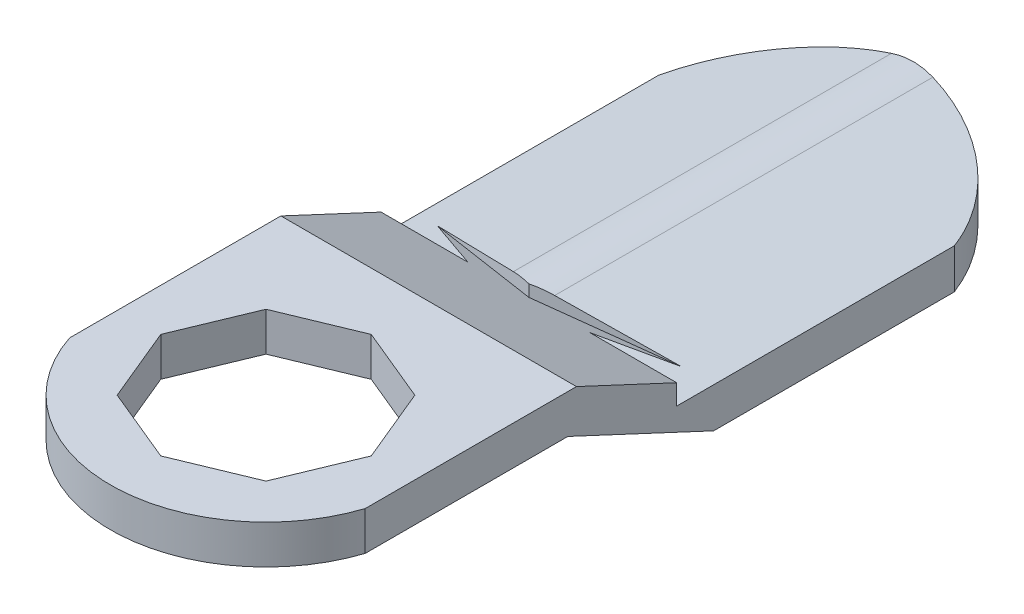
ISO-10303-21;
HEADER;
FILE_DESCRIPTION(('STEP AP214'),'2;1');
FILE_NAME('part.step','',(''),(''),'','','');
FILE_SCHEMA(('AUTOMOTIVE_DESIGN { 1 0 10303 214 1 1 1 1 }'));
ENDSEC;
DATA;
#1=APPLICATION_CONTEXT('core data for automotive mechanical design processes');
#2=APPLICATION_PROTOCOL_DEFINITION('international standard','automotive_design',2000,#1);
#3=PRODUCT_CONTEXT('',#1,'mechanical');
#4=PRODUCT('Part','Part','',(#3));
#5=PRODUCT_RELATED_PRODUCT_CATEGORY('part','',(#4));
#6=PRODUCT_DEFINITION_FORMATION('','',#4);
#7=PRODUCT_DEFINITION_CONTEXT('part definition',#1,'design');
#8=PRODUCT_DEFINITION('design','',#6,#7);
#9=PRODUCT_DEFINITION_SHAPE('','',#8);
#10=(LENGTH_UNIT() NAMED_UNIT(*) SI_UNIT(.MILLI.,.METRE.));
#11=(NAMED_UNIT(*) PLANE_ANGLE_UNIT() SI_UNIT($,.RADIAN.));
#12=(NAMED_UNIT(*) SI_UNIT($,.STERADIAN.) SOLID_ANGLE_UNIT());
#13=UNCERTAINTY_MEASURE_WITH_UNIT(LENGTH_MEASURE(1.E-05),#10,'distance_accuracy_value','');
#14=(GEOMETRIC_REPRESENTATION_CONTEXT(3) GLOBAL_UNCERTAINTY_ASSIGNED_CONTEXT((#13)) GLOBAL_UNIT_ASSIGNED_CONTEXT((#10,
#11,#12)) REPRESENTATION_CONTEXT('',''));
#15=CARTESIAN_POINT('',(0.,0.,0.));
#16=DIRECTION('',(0.,0.,1.));
#17=DIRECTION('',(1.,0.,0.));
#18=AXIS2_PLACEMENT_3D('',#15,#16,#17);
#19=CARTESIAN_POINT('',(0.,2.,0.));
#20=DIRECTION('',(0.,-1.,0.));
#21=DIRECTION('',(0.,0.,-1.));
#22=AXIS2_PLACEMENT_3D('',#19,#20,#21);
#23=PLANE('',#22);
#24=DIRECTION('',(-0.923879532511282,0.,-0.382683432365101));
#25=VECTOR('',#24,1.);
#26=CARTESIAN_POINT('',(3.82683432365094,2.,-3.82683432365085));
#27=LINE('',#26,#25);
#28=CARTESIAN_POINT('',(3.82683432365094,2.,-3.82683432365085));
#29=VERTEX_POINT('',#28);
#30=CARTESIAN_POINT('',(0.,2.,-5.41196100146197));
#31=VERTEX_POINT('',#30);
#32=EDGE_CURVE('E328',#29,#31,#27,.T.);
#33=ORIENTED_EDGE('',*,*,#32,.F.);
#34=DIRECTION('',(-0.382683432365084,0.,-0.923879532511289));
#35=VECTOR('',#34,1.);
#36=CARTESIAN_POINT('',(5.41196100146197,2.,0.));
#37=LINE('',#36,#35);
#38=CARTESIAN_POINT('',(5.41196100146197,2.,0.));
#39=VERTEX_POINT('',#38);
#40=EDGE_CURVE('E343',#39,#29,#37,.T.);
#41=ORIENTED_EDGE('',*,*,#40,.F.);
#42=DIRECTION('',(0.382683432365096,0.,-0.923879532511284));
#43=VECTOR('',#42,1.);
#44=CARTESIAN_POINT('',(3.82683432365085,2.,3.82683432365095));
#45=LINE('',#44,#43);
#46=CARTESIAN_POINT('',(3.82683432365085,2.,3.82683432365095));
#47=VERTEX_POINT('',#46);
#48=EDGE_CURVE('E341',#47,#39,#45,.T.);
#49=ORIENTED_EDGE('',*,*,#48,.F.);
#50=DIRECTION('',(0.923879532511291,0.,-0.382683432365079));
#51=VECTOR('',#50,1.);
#52=CARTESIAN_POINT('',(0.,2.,5.41196100146197));
#53=LINE('',#52,#51);
#54=CARTESIAN_POINT('',(0.,2.,5.41196100146197));
#55=VERTEX_POINT('',#54);
#56=EDGE_CURVE('E339',#55,#47,#53,.T.);
#57=ORIENTED_EDGE('',*,*,#56,.F.);
#58=DIRECTION('',(0.923879532511282,0.,0.382683432365102));
#59=VECTOR('',#58,1.);
#60=CARTESIAN_POINT('',(-3.82683432365095,2.,3.82683432365085));
#61=LINE('',#60,#59);
#62=CARTESIAN_POINT('',(-3.82683432365095,2.,3.82683432365085));
#63=VERTEX_POINT('',#62);
#64=EDGE_CURVE('E337',#63,#55,#61,.T.);
#65=ORIENTED_EDGE('',*,*,#64,.F.);
#66=DIRECTION('',(0.382683432365078,0.,0.923879532511292));
#67=VECTOR('',#66,1.);
#68=CARTESIAN_POINT('',(-5.41196100146197,2.,0.));
#69=LINE('',#68,#67);
#70=CARTESIAN_POINT('',(-5.41196100146197,2.,0.));
#71=VERTEX_POINT('',#70);
#72=EDGE_CURVE('E335',#71,#63,#69,.T.);
#73=ORIENTED_EDGE('',*,*,#72,.F.);
#74=DIRECTION('',(-0.382683432365101,0.,0.923879532511282));
#75=VECTOR('',#74,1.);
#76=CARTESIAN_POINT('',(-3.82683432365085,2.,-3.82683432365095));
#77=LINE('',#76,#75);
#78=CARTESIAN_POINT('',(-3.82683432365085,2.,-3.82683432365095));
#79=VERTEX_POINT('',#78);
#80=EDGE_CURVE('E333',#79,#71,#77,.T.);
#81=ORIENTED_EDGE('',*,*,#80,.F.);
#82=DIRECTION('',(-0.923879532511292,0.,0.382683432365078));
#83=VECTOR('',#82,1.);
#84=CARTESIAN_POINT('',(0.,2.,-5.41196100146197));
#85=LINE('',#84,#83);
#86=EDGE_CURVE('E330',#31,#79,#85,.T.);
#87=ORIENTED_EDGE('',*,*,#86,.F.);
#88=EDGE_LOOP('',(#33,#41,#49,#57,#65,#73,#81,#87));
#89=FACE_BOUND('',#88,.T.);
#90=DIRECTION('',(-1.,0.,0.));
#91=VECTOR('',#90,1.);
#92=CARTESIAN_POINT('',(43.9052680421348,2.,-8.36433897369595));
#93=LINE('',#92,#91);
#94=CARTESIAN_POINT('',(7.6,2.,-8.36433897369594));
#95=VERTEX_POINT('',#94);
#96=CARTESIAN_POINT('',(-7.6,2.,-8.36433897369593));
#97=VERTEX_POINT('',#96);
#98=EDGE_CURVE('E450',#95,#97,#93,.T.);
#99=ORIENTED_EDGE('',*,*,#98,.T.);
#100=DIRECTION('',(0.,0.,1.));
#101=VECTOR('',#100,1.);
#102=CARTESIAN_POINT('',(-7.6,2.,2.49799919935938));
#103=LINE('',#102,#101);
#104=CARTESIAN_POINT('',(-7.6,2.,2.49799919935938));
#105=VERTEX_POINT('',#104);
#106=EDGE_CURVE('E315',#97,#105,#103,.T.);
#107=ORIENTED_EDGE('',*,*,#106,.T.);
#108=CARTESIAN_POINT('',(0.,2.,0.));
#109=DIRECTION('',(0.,1.,0.));
#110=DIRECTION('',(0.,0.,-1.));
#111=AXIS2_PLACEMENT_3D('',#108,#109,#110);
#112=CIRCLE('',#111,8.);
#113=CARTESIAN_POINT('',(7.6,2.,2.49799919935937));
#114=VERTEX_POINT('',#113);
#115=EDGE_CURVE('E385',#105,#114,#112,.T.);
#116=ORIENTED_EDGE('',*,*,#115,.T.);
#117=DIRECTION('',(0.,0.,-1.));
#118=VECTOR('',#117,1.);
#119=CARTESIAN_POINT('',(7.6,2.,2.49799919935937));
#120=LINE('',#119,#118);
#121=EDGE_CURVE('E388',#114,#95,#120,.T.);
#122=ORIENTED_EDGE('',*,*,#121,.T.);
#123=EDGE_LOOP('',(#99,#107,#116,#122));
#124=FACE_BOUND('',#123,.T.);
#125=ADVANCED_FACE('F35',(#89,#124),#23,.F.);
#126=CARTESIAN_POINT('',(7.6,2.,2.49799919935937));
#127=DIRECTION('',(-1.,0.,0.));
#128=DIRECTION('',(0.,0.,1.));
#129=AXIS2_PLACEMENT_3D('',#126,#127,#128);
#130=PLANE('',#129);
#131=DIRECTION('',(0.,0.,-1.));
#132=VECTOR('',#131,1.);
#133=CARTESIAN_POINT('',(7.6,0.,2.49799919935937));
#134=LINE('',#133,#132);
#135=CARTESIAN_POINT('',(7.6,0.,2.49799919935937));
#136=VERTEX_POINT('',#135);
#137=CARTESIAN_POINT('',(7.59999999999999,0.,-7.92064030019684));
#138=VERTEX_POINT('',#137);
#139=EDGE_CURVE('E396',#136,#138,#134,.T.);
#140=ORIENTED_EDGE('',*,*,#139,.T.);
#141=DIRECTION('',(0.,0.422885465331124,0.906183139995265));
#142=VECTOR('',#141,1.);
#143=CARTESIAN_POINT('',(7.6,4.35020856734818,1.40123520126355));
#144=LINE('',#143,#142);
#145=CARTESIAN_POINT('',(7.59999999999997,-3.5,-15.4206403001968));
#146=VERTEX_POINT('',#145);
#147=EDGE_CURVE('E454',#146,#138,#144,.T.);
#148=ORIENTED_EDGE('',*,*,#147,.F.);
#149=DIRECTION('',(0.,0.,-1.));
#150=VECTOR('',#149,1.);
#151=CARTESIAN_POINT('',(7.6,-3.5,-15.4206403001968));
#152=LINE('',#151,#150);
#153=CARTESIAN_POINT('',(7.59999999999997,-3.5,-27.7979991993594));
#154=VERTEX_POINT('',#153);
#155=EDGE_CURVE('E441',#146,#154,#152,.T.);
#156=ORIENTED_EDGE('',*,*,#155,.T.);
#157=DIRECTION('',(0.,1.,0.));
#158=VECTOR('',#157,1.);
#159=CARTESIAN_POINT('',(7.59999999999997,-3.5,-27.7979991993594));
#160=LINE('',#159,#158);
#161=CARTESIAN_POINT('',(7.59999999999997,-1.44636409465411,-27.7979991993594));
#162=VERTEX_POINT('',#161);
#163=EDGE_CURVE('E227',#154,#162,#160,.T.);
#164=ORIENTED_EDGE('',*,*,#163,.T.);
#165=DIRECTION('',(0.,0.,-1.));
#166=VECTOR('',#165,1.);
#167=CARTESIAN_POINT('',(7.59999999999997,-1.44636409465411,-13.5177767182546));
#168=LINE('',#167,#166);
#169=CARTESIAN_POINT('',(7.59999999999997,-1.44636409465411,-13.5177767182546));
#170=VERTEX_POINT('',#169);
#171=EDGE_CURVE('E216',#170,#162,#168,.T.);
#172=ORIENTED_EDGE('',*,*,#171,.F.);
#173=DIRECTION('',(0.,1.,0.));
#174=VECTOR('',#173,1.);
#175=CARTESIAN_POINT('',(7.6,2.,-13.5177767182546));
#176=LINE('',#175,#174);
#177=CARTESIAN_POINT('',(7.6,-0.404937614127393,-13.5177767182546));
#178=VERTEX_POINT('',#177);
#179=EDGE_CURVE('E202',#170,#178,#176,.T.);
#180=ORIENTED_EDGE('',*,*,#179,.T.);
#181=DIRECTION('',(0.,-0.422885465331124,-0.906183139995265));
#182=VECTOR('',#181,1.);
#183=CARTESIAN_POINT('',(7.6,6.16257484733871,0.555464270601307));
#184=LINE('',#183,#182);
#185=EDGE_CURVE('E319',#95,#178,#184,.T.);
#186=ORIENTED_EDGE('',*,*,#185,.F.);
#187=ORIENTED_EDGE('',*,*,#121,.F.);
#188=DIRECTION('',(0.,-1.,0.));
#189=VECTOR('',#188,1.);
#190=CARTESIAN_POINT('',(7.6,2.,2.49799919935937));
#191=LINE('',#190,#189);
#192=EDGE_CURVE('E404',#114,#136,#191,.T.);
#193=ORIENTED_EDGE('',*,*,#192,.T.);
#194=EDGE_LOOP('',(#140,#148,#156,#164,#172,#180,#186,#187,#193));
#195=FACE_BOUND('',#194,.T.);
#196=ADVANCED_FACE('F224',(#195),#130,.F.);
#197=CARTESIAN_POINT('',(-7.6,2.,2.49799919935938));
#198=DIRECTION('',(1.,0.,0.));
#199=DIRECTION('',(0.,0.,-1.));
#200=AXIS2_PLACEMENT_3D('',#197,#198,#199);
#201=PLANE('',#200);
#202=DIRECTION('',(0.,0.422885465331124,0.906183139995265));
#203=VECTOR('',#202,1.);
#204=CARTESIAN_POINT('',(-7.6,6.16257484733871,0.555464270601309));
#205=LINE('',#204,#203);
#206=CARTESIAN_POINT('',(-7.6,-0.404937614127395,-13.5177767182546));
#207=VERTEX_POINT('',#206);
#208=EDGE_CURVE('E312',#207,#97,#205,.T.);
#209=ORIENTED_EDGE('',*,*,#208,.F.);
#210=DIRECTION('',(0.,-1.,0.));
#211=VECTOR('',#210,1.);
#212=CARTESIAN_POINT('',(-7.6,2.,-13.5177767182546));
#213=LINE('',#212,#211);
#214=CARTESIAN_POINT('',(-7.59999999999997,-1.44636409465411,-13.5177767182546));
#215=VERTEX_POINT('',#214);
#216=EDGE_CURVE('E238',#207,#215,#213,.T.);
#217=ORIENTED_EDGE('',*,*,#216,.T.);
#218=DIRECTION('',(0.,0.,-1.));
#219=VECTOR('',#218,1.);
#220=CARTESIAN_POINT('',(-7.59999999999997,-1.44636409465411,-13.5177767182546));
#221=LINE('',#220,#219);
#222=CARTESIAN_POINT('',(-7.59999999999997,-1.44636409465411,-27.7979991993594));
#223=VERTEX_POINT('',#222);
#224=EDGE_CURVE('E485',#215,#223,#221,.T.);
#225=ORIENTED_EDGE('',*,*,#224,.T.);
#226=DIRECTION('',(0.,1.,0.));
#227=VECTOR('',#226,1.);
#228=CARTESIAN_POINT('',(-7.59999999999997,-3.5,-27.7979991993594));
#229=LINE('',#228,#227);
#230=CARTESIAN_POINT('',(-7.59999999999997,-3.5,-27.7979991993594));
#231=VERTEX_POINT('',#230);
#232=EDGE_CURVE('E439',#231,#223,#229,.T.);
#233=ORIENTED_EDGE('',*,*,#232,.F.);
#234=DIRECTION('',(0.,0.,1.));
#235=VECTOR('',#234,1.);
#236=CARTESIAN_POINT('',(-7.59999999999997,-3.5,-15.4206403001968));
#237=LINE('',#236,#235);
#238=CARTESIAN_POINT('',(-7.59999999999997,-3.5,-15.4206403001968));
#239=VERTEX_POINT('',#238);
#240=EDGE_CURVE('E429',#231,#239,#237,.T.);
#241=ORIENTED_EDGE('',*,*,#240,.T.);
#242=DIRECTION('',(0.,-0.422885465331124,-0.906183139995265));
#243=VECTOR('',#242,1.);
#244=CARTESIAN_POINT('',(-7.6,4.35020856734818,1.40123520126356));
#245=LINE('',#244,#243);
#246=CARTESIAN_POINT('',(-7.6,0.,-7.92064030019684));
#247=VERTEX_POINT('',#246);
#248=EDGE_CURVE('E437',#247,#239,#245,.T.);
#249=ORIENTED_EDGE('',*,*,#248,.F.);
#250=DIRECTION('',(0.,0.,1.));
#251=VECTOR('',#250,1.);
#252=CARTESIAN_POINT('',(-7.6,0.,2.49799919935938));
#253=LINE('',#252,#251);
#254=CARTESIAN_POINT('',(-7.6,0.,2.49799919935938));
#255=VERTEX_POINT('',#254);
#256=EDGE_CURVE('E389',#247,#255,#253,.T.);
#257=ORIENTED_EDGE('',*,*,#256,.T.);
#258=DIRECTION('',(0.,-1.,0.));
#259=VECTOR('',#258,1.);
#260=CARTESIAN_POINT('',(-7.6,2.,2.49799919935938));
#261=LINE('',#260,#259);
#262=EDGE_CURVE('E393',#105,#255,#261,.T.);
#263=ORIENTED_EDGE('',*,*,#262,.F.);
#264=ORIENTED_EDGE('',*,*,#106,.F.);
#265=EDGE_LOOP('',(#209,#217,#225,#233,#241,#249,#257,#263,#264));
#266=FACE_BOUND('',#265,.T.);
#267=ADVANCED_FACE('F291',(#266),#201,.F.);
#268=CARTESIAN_POINT('',(0.,-6.,9.57557128020675));
#269=DIRECTION('',(0.,1.,0.));
#270=DIRECTION('',(0.,0.,1.));
#271=AXIS2_PLACEMENT_3D('',#268,#269,#270);
#272=CYLINDRICAL_SURFACE('',#271,19.0755712802068);
#273=CARTESIAN_POINT('',(0.,0.,9.57557128020675));
#274=DIRECTION('',(0.,1.,0.));
#275=DIRECTION('',(0.,0.,1.));
#276=AXIS2_PLACEMENT_3D('',#273,#274,#275);
#277=CIRCLE('',#276,19.0755712802068);
#278=EDGE_CURVE('E398',#138,#247,#277,.T.);
#279=ORIENTED_EDGE('',*,*,#278,.T.);
#280=CARTESIAN_POINT('',(0.,8.16489873752167,9.57557128020675));
#281=DIRECTION('',(0.,-0.906183139995265,0.422885465331124));
#282=DIRECTION('',(0.,0.422885465331124,0.906183139995265));
#283=AXIS2_PLACEMENT_3D('',#280,#281,#282);
#284=ELLIPSE('',#283,21.0504592706353,19.0755712802068);
#285=EDGE_CURVE('E324',#247,#138,#284,.T.);
#286=ORIENTED_EDGE('',*,*,#285,.T.);
#287=EDGE_LOOP('',(#279,#286));
#288=FACE_BOUND('',#287,.T.);
#289=ADVANCED_FACE('F301',(#288),#272,.F.);
#290=CARTESIAN_POINT('',(0.,0.,0.));
#291=DIRECTION('',(0.,-1.,0.));
#292=DIRECTION('',(0.,0.,-1.));
#293=AXIS2_PLACEMENT_3D('',#290,#291,#292);
#294=PLANE('',#293);
#295=ORIENTED_EDGE('',*,*,#256,.F.);
#296=ORIENTED_EDGE('',*,*,#278,.F.);
#297=ORIENTED_EDGE('',*,*,#139,.F.);
#298=CARTESIAN_POINT('',(0.,0.,0.));
#299=DIRECTION('',(0.,1.,0.));
#300=DIRECTION('',(0.,0.,-1.));
#301=AXIS2_PLACEMENT_3D('',#298,#299,#300);
#302=CIRCLE('',#301,8.);
#303=EDGE_CURVE('E384',#255,#136,#302,.T.);
#304=ORIENTED_EDGE('',*,*,#303,.F.);
#305=EDGE_LOOP('',(#295,#296,#297,#304));
#306=FACE_BOUND('',#305,.T.);
#307=DIRECTION('',(-0.382683432365084,0.,-0.923879532511289));
#308=VECTOR('',#307,1.);
#309=CARTESIAN_POINT('',(5.41196100146197,0.,0.));
#310=LINE('',#309,#308);
#311=CARTESIAN_POINT('',(5.41196100146197,0.,0.));
#312=VERTEX_POINT('',#311);
#313=CARTESIAN_POINT('',(3.82683432365094,0.,-3.82683432365085));
#314=VERTEX_POINT('',#313);
#315=EDGE_CURVE('E331',#312,#314,#310,.T.);
#316=ORIENTED_EDGE('',*,*,#315,.T.);
#317=DIRECTION('',(-0.923879532511282,0.,-0.382683432365101));
#318=VECTOR('',#317,1.);
#319=CARTESIAN_POINT('',(3.82683432365094,0.,-3.82683432365085));
#320=LINE('',#319,#318);
#321=CARTESIAN_POINT('',(0.,0.,-5.41196100146197));
#322=VERTEX_POINT('',#321);
#323=EDGE_CURVE('E322',#314,#322,#320,.T.);
#324=ORIENTED_EDGE('',*,*,#323,.T.);
#325=DIRECTION('',(-0.923879532511292,0.,0.382683432365078));
#326=VECTOR('',#325,1.);
#327=CARTESIAN_POINT('',(0.,0.,-5.41196100146197));
#328=LINE('',#327,#326);
#329=CARTESIAN_POINT('',(-3.82683432365085,0.,-3.82683432365095));
#330=VERTEX_POINT('',#329);
#331=EDGE_CURVE('E348',#322,#330,#328,.T.);
#332=ORIENTED_EDGE('',*,*,#331,.T.);
#333=DIRECTION('',(-0.382683432365101,0.,0.923879532511282));
#334=VECTOR('',#333,1.);
#335=CARTESIAN_POINT('',(-3.82683432365085,0.,-3.82683432365095));
#336=LINE('',#335,#334);
#337=CARTESIAN_POINT('',(-5.41196100146197,0.,0.));
#338=VERTEX_POINT('',#337);
#339=EDGE_CURVE('E351',#330,#338,#336,.T.);
#340=ORIENTED_EDGE('',*,*,#339,.T.);
#341=DIRECTION('',(0.382683432365078,0.,0.923879532511292));
#342=VECTOR('',#341,1.);
#343=CARTESIAN_POINT('',(-5.41196100146197,0.,0.));
#344=LINE('',#343,#342);
#345=CARTESIAN_POINT('',(-3.82683432365095,0.,3.82683432365085));
#346=VERTEX_POINT('',#345);
#347=EDGE_CURVE('E354',#338,#346,#344,.T.);
#348=ORIENTED_EDGE('',*,*,#347,.T.);
#349=DIRECTION('',(0.923879532511282,0.,0.382683432365102));
#350=VECTOR('',#349,1.);
#351=CARTESIAN_POINT('',(-3.82683432365095,0.,3.82683432365085));
#352=LINE('',#351,#350);
#353=CARTESIAN_POINT('',(0.,0.,5.41196100146197));
#354=VERTEX_POINT('',#353);
#355=EDGE_CURVE('E357',#346,#354,#352,.T.);
#356=ORIENTED_EDGE('',*,*,#355,.T.);
#357=DIRECTION('',(0.923879532511291,0.,-0.382683432365079));
#358=VECTOR('',#357,1.);
#359=CARTESIAN_POINT('',(0.,0.,5.41196100146197));
#360=LINE('',#359,#358);
#361=CARTESIAN_POINT('',(3.82683432365085,0.,3.82683432365095));
#362=VERTEX_POINT('',#361);
#363=EDGE_CURVE('E360',#354,#362,#360,.T.);
#364=ORIENTED_EDGE('',*,*,#363,.T.);
#365=DIRECTION('',(0.382683432365096,0.,-0.923879532511284));
#366=VECTOR('',#365,1.);
#367=CARTESIAN_POINT('',(3.82683432365085,0.,3.82683432365095));
#368=LINE('',#367,#366);
#369=EDGE_CURVE('E363',#362,#312,#368,.T.);
#370=ORIENTED_EDGE('',*,*,#369,.T.);
#371=EDGE_LOOP('',(#316,#324,#332,#340,#348,#356,#364,#370));
#372=FACE_BOUND('',#371,.T.);
#373=ADVANCED_FACE('F298',(#306,#372),#294,.T.);
#374=CARTESIAN_POINT('',(0.,2.,0.));
#375=DIRECTION('',(0.,-1.,0.));
#376=DIRECTION('',(0.,0.,-1.));
#377=AXIS2_PLACEMENT_3D('',#374,#375,#376);
#378=CYLINDRICAL_SURFACE('',#377,8.);
#379=ORIENTED_EDGE('',*,*,#303,.T.);
#380=ORIENTED_EDGE('',*,*,#192,.F.);
#381=ORIENTED_EDGE('',*,*,#115,.F.);
#382=ORIENTED_EDGE('',*,*,#262,.T.);
#383=EDGE_LOOP('',(#379,#380,#381,#382));
#384=FACE_BOUND('',#383,.T.);
#385=ADVANCED_FACE('F37',(#384),#378,.T.);
#386=CARTESIAN_POINT('',(3.82683432365094,2.,-3.82683432365085));
#387=DIRECTION('',(-0.382683432365101,0.,0.923879532511282));
#388=DIRECTION('',(0.923879532511282,0.,0.382683432365101));
#389=AXIS2_PLACEMENT_3D('',#386,#387,#388);
#390=PLANE('',#389);
#391=ORIENTED_EDGE('',*,*,#323,.F.);
#392=DIRECTION('',(0.,-1.,0.));
#393=VECTOR('',#392,1.);
#394=CARTESIAN_POINT('',(3.82683432365094,2.,-3.82683432365085));
#395=LINE('',#394,#393);
#396=EDGE_CURVE('E345',#29,#314,#395,.T.);
#397=ORIENTED_EDGE('',*,*,#396,.F.);
#398=ORIENTED_EDGE('',*,*,#32,.T.);
#399=DIRECTION('',(0.,-1.,0.));
#400=VECTOR('',#399,1.);
#401=CARTESIAN_POINT('',(0.,2.,-5.41196100146197));
#402=LINE('',#401,#400);
#403=EDGE_CURVE('E381',#31,#322,#402,.T.);
#404=ORIENTED_EDGE('',*,*,#403,.T.);
#405=EDGE_LOOP('',(#391,#397,#398,#404));
#406=FACE_BOUND('',#405,.T.);
#407=ADVANCED_FACE('F296',(#406),#390,.T.);
#408=CARTESIAN_POINT('',(0.,2.,-5.41196100146197));
#409=DIRECTION('',(0.382683432365078,0.,0.923879532511292));
#410=DIRECTION('',(0.923879532511292,0.,-0.382683432365078));
#411=AXIS2_PLACEMENT_3D('',#408,#409,#410);
#412=PLANE('',#411);
#413=ORIENTED_EDGE('',*,*,#331,.F.);
#414=ORIENTED_EDGE('',*,*,#403,.F.);
#415=ORIENTED_EDGE('',*,*,#86,.T.);
#416=DIRECTION('',(0.,-1.,0.));
#417=VECTOR('',#416,1.);
#418=CARTESIAN_POINT('',(-3.82683432365085,2.,-3.82683432365095));
#419=LINE('',#418,#417);
#420=EDGE_CURVE('E379',#79,#330,#419,.T.);
#421=ORIENTED_EDGE('',*,*,#420,.T.);
#422=EDGE_LOOP('',(#413,#414,#415,#421));
#423=FACE_BOUND('',#422,.T.);
#424=ADVANCED_FACE('F536',(#423),#412,.T.);
#425=CARTESIAN_POINT('',(-3.82683432365085,2.,-3.82683432365095));
#426=DIRECTION('',(0.923879532511282,0.,0.382683432365101));
#427=DIRECTION('',(0.382683432365101,0.,-0.923879532511282));
#428=AXIS2_PLACEMENT_3D('',#425,#426,#427);
#429=PLANE('',#428);
#430=ORIENTED_EDGE('',*,*,#339,.F.);
#431=ORIENTED_EDGE('',*,*,#420,.F.);
#432=ORIENTED_EDGE('',*,*,#80,.T.);
#433=DIRECTION('',(0.,-1.,0.));
#434=VECTOR('',#433,1.);
#435=CARTESIAN_POINT('',(-5.41196100146197,2.,0.));
#436=LINE('',#435,#434);
#437=EDGE_CURVE('E377',#71,#338,#436,.T.);
#438=ORIENTED_EDGE('',*,*,#437,.T.);
#439=EDGE_LOOP('',(#430,#431,#432,#438));
#440=FACE_BOUND('',#439,.T.);
#441=ADVANCED_FACE('F533',(#440),#429,.T.);
#442=CARTESIAN_POINT('',(-5.41196100146197,2.,0.));
#443=DIRECTION('',(0.923879532511292,0.,-0.382683432365078));
#444=DIRECTION('',(-0.382683432365078,0.,-0.923879532511292));
#445=AXIS2_PLACEMENT_3D('',#442,#443,#444);
#446=PLANE('',#445);
#447=ORIENTED_EDGE('',*,*,#347,.F.);
#448=ORIENTED_EDGE('',*,*,#437,.F.);
#449=ORIENTED_EDGE('',*,*,#72,.T.);
#450=DIRECTION('',(0.,-1.,0.));
#451=VECTOR('',#450,1.);
#452=CARTESIAN_POINT('',(-3.82683432365095,2.,3.82683432365085));
#453=LINE('',#452,#451);
#454=EDGE_CURVE('E375',#63,#346,#453,.T.);
#455=ORIENTED_EDGE('',*,*,#454,.T.);
#456=EDGE_LOOP('',(#447,#448,#449,#455));
#457=FACE_BOUND('',#456,.T.);
#458=ADVANCED_FACE('F529',(#457),#446,.T.);
#459=CARTESIAN_POINT('',(-3.82683432365095,2.,3.82683432365085));
#460=DIRECTION('',(0.382683432365102,0.,-0.923879532511282));
#461=DIRECTION('',(-0.923879532511282,0.,-0.382683432365102));
#462=AXIS2_PLACEMENT_3D('',#459,#460,#461);
#463=PLANE('',#462);
#464=ORIENTED_EDGE('',*,*,#355,.F.);
#465=ORIENTED_EDGE('',*,*,#454,.F.);
#466=ORIENTED_EDGE('',*,*,#64,.T.);
#467=DIRECTION('',(0.,-1.,0.));
#468=VECTOR('',#467,1.);
#469=CARTESIAN_POINT('',(0.,2.,5.41196100146197));
#470=LINE('',#469,#468);
#471=EDGE_CURVE('E373',#55,#354,#470,.T.);
#472=ORIENTED_EDGE('',*,*,#471,.T.);
#473=EDGE_LOOP('',(#464,#465,#466,#472));
#474=FACE_BOUND('',#473,.T.);
#475=ADVANCED_FACE('F525',(#474),#463,.T.);
#476=CARTESIAN_POINT('',(0.,2.,5.41196100146197));
#477=DIRECTION('',(-0.382683432365079,0.,-0.923879532511291));
#478=DIRECTION('',(-0.923879532511291,0.,0.382683432365079));
#479=AXIS2_PLACEMENT_3D('',#476,#477,#478);
#480=PLANE('',#479);
#481=ORIENTED_EDGE('',*,*,#363,.F.);
#482=ORIENTED_EDGE('',*,*,#471,.F.);
#483=ORIENTED_EDGE('',*,*,#56,.T.);
#484=DIRECTION('',(0.,-1.,0.));
#485=VECTOR('',#484,1.);
#486=CARTESIAN_POINT('',(3.82683432365085,2.,3.82683432365095));
#487=LINE('',#486,#485);
#488=EDGE_CURVE('E371',#47,#362,#487,.T.);
#489=ORIENTED_EDGE('',*,*,#488,.T.);
#490=EDGE_LOOP('',(#481,#482,#483,#489));
#491=FACE_BOUND('',#490,.T.);
#492=ADVANCED_FACE('F521',(#491),#480,.T.);
#493=CARTESIAN_POINT('',(3.82683432365085,2.,3.82683432365095));
#494=DIRECTION('',(-0.923879532511284,0.,-0.382683432365096));
#495=DIRECTION('',(-0.382683432365096,0.,0.923879532511285));
#496=AXIS2_PLACEMENT_3D('',#493,#494,#495);
#497=PLANE('',#496);
#498=ORIENTED_EDGE('',*,*,#369,.F.);
#499=ORIENTED_EDGE('',*,*,#488,.F.);
#500=ORIENTED_EDGE('',*,*,#48,.T.);
#501=DIRECTION('',(0.,-1.,0.));
#502=VECTOR('',#501,1.);
#503=CARTESIAN_POINT('',(5.41196100146197,2.,0.));
#504=LINE('',#503,#502);
#505=EDGE_CURVE('E58',#39,#312,#504,.T.);
#506=ORIENTED_EDGE('',*,*,#505,.T.);
#507=EDGE_LOOP('',(#498,#499,#500,#506));
#508=FACE_BOUND('',#507,.T.);
#509=ADVANCED_FACE('F515',(#508),#497,.T.);
#510=CARTESIAN_POINT('',(5.41196100146197,2.,0.));
#511=DIRECTION('',(-0.923879532511289,0.,0.382683432365084));
#512=DIRECTION('',(0.382683432365084,0.,0.923879532511289));
#513=AXIS2_PLACEMENT_3D('',#510,#511,#512);
#514=PLANE('',#513);
#515=ORIENTED_EDGE('',*,*,#315,.F.);
#516=ORIENTED_EDGE('',*,*,#505,.F.);
#517=ORIENTED_EDGE('',*,*,#40,.T.);
#518=ORIENTED_EDGE('',*,*,#396,.T.);
#519=EDGE_LOOP('',(#515,#516,#517,#518));
#520=FACE_BOUND('',#519,.T.);
#521=ADVANCED_FACE('F508',(#520),#514,.T.);
#522=CARTESIAN_POINT('',(43.9052680421348,-3.5,-15.4206403001969));
#523=DIRECTION('',(0.,-0.906183139995265,0.422885465331124));
#524=DIRECTION('',(0.,-0.422885465331124,-0.906183139995265));
#525=AXIS2_PLACEMENT_3D('',#522,#523,#524);
#526=PLANE('',#525);
#527=DIRECTION('',(-0.875730310753049,-0.204169357911961,-0.437505766954202));
#528=VECTOR('',#527,1.);
#529=CARTESIAN_POINT('',(31.899574304697,5.70900261708532,4.31293673641456));
#530=LINE('',#529,#528);
#531=CARTESIAN_POINT('',(-3.79114662753835,-2.61199699509363,-13.5177767182546));
#532=VERTEX_POINT('',#531);
#533=EDGE_CURVE('E247',#532,#239,#530,.T.);
#534=ORIENTED_EDGE('',*,*,#533,.F.);
#535=DIRECTION('',(-1.,0.,0.));
#536=VECTOR('',#535,1.);
#537=CARTESIAN_POINT('',(43.9052680421348,-2.61199699509363,-13.5177767182546));
#538=LINE('',#537,#536);
#539=CARTESIAN_POINT('',(3.79114662753841,-2.61199699509364,-13.5177767182546));
#540=VERTEX_POINT('',#539);
#541=EDGE_CURVE('E236',#540,#532,#538,.T.);
#542=ORIENTED_EDGE('',*,*,#541,.F.);
#543=DIRECTION('',(-0.875730310753049,0.204169357911961,0.437505766954203));
#544=VECTOR('',#543,1.);
#545=CARTESIAN_POINT('',(35.4426399316882,-9.99128372927785,-29.3305340057922));
#546=LINE('',#545,#544);
#547=EDGE_CURVE('E243',#146,#540,#546,.T.);
#548=ORIENTED_EDGE('',*,*,#547,.F.);
#549=ORIENTED_EDGE('',*,*,#147,.T.);
#550=ORIENTED_EDGE('',*,*,#285,.F.);
#551=ORIENTED_EDGE('',*,*,#248,.T.);
#552=EDGE_LOOP('',(#534,#542,#548,#549,#550,#551));
#553=FACE_BOUND('',#552,.T.);
#554=ADVANCED_FACE('F506',(#553),#526,.T.);
#555=CARTESIAN_POINT('',(43.9052680421348,2.,-8.36433897369595));
#556=DIRECTION('',(0.,0.906183139995265,-0.422885465331124));
#557=DIRECTION('',(0.,0.422885465331124,0.906183139995265));
#558=AXIS2_PLACEMENT_3D('',#555,#556,#557);
#559=PLANE('',#558);
#560=DIRECTION('',(1.,0.,0.));
#561=VECTOR('',#560,1.);
#562=CARTESIAN_POINT('',(43.9052680421348,-0.404937614127387,-13.5177767182546));
#563=LINE('',#562,#561);
#564=CARTESIAN_POINT('',(3.13307731999928,-0.404937614127394,-13.5177767182546));
#565=VERTEX_POINT('',#564);
#566=EDGE_CURVE('E207',#565,#178,#563,.T.);
#567=ORIENTED_EDGE('',*,*,#566,.F.);
#568=DIRECTION('',(-0.87573031075305,0.204169357911961,0.437505766954202));
#569=VECTOR('',#568,1.);
#570=CARTESIAN_POINT('',(31.9969469004865,-7.13431268170396,-27.9378661487759));
#571=LINE('',#570,#569);
#572=CARTESIAN_POINT('',(6.28078783844212,-1.13880057119527,-15.0903401976858));
#573=VERTEX_POINT('',#572);
#574=EDGE_CURVE('E219',#573,#565,#571,.T.);
#575=ORIENTED_EDGE('',*,*,#574,.F.);
#576=DIRECTION('',(0.963884768567449,-0.112622706693601,-0.241334371486288));
#577=VECTOR('',#576,1.);
#578=CARTESIAN_POINT('',(8.1109762977113,-1.35264436742896,-15.5485769039009));
#579=LINE('',#578,#577);
#580=CARTESIAN_POINT('',(0.,-0.404937614127395,-13.5177767182546));
#581=VERTEX_POINT('',#580);
#582=EDGE_CURVE('E407',#581,#573,#579,.T.);
#583=ORIENTED_EDGE('',*,*,#582,.F.);
#584=DIRECTION('',(0.963884768567449,0.112622706693601,0.241334371486288));
#585=VECTOR('',#584,1.);
#586=CARTESIAN_POINT('',(-8.1109762977113,-1.35264436742896,-15.5485769039009));
#587=LINE('',#586,#585);
#588=CARTESIAN_POINT('',(-6.28078783844224,-1.1388005711953,-15.0903401976859));
#589=VERTEX_POINT('',#588);
#590=EDGE_CURVE('E320',#589,#581,#587,.T.);
#591=ORIENTED_EDGE('',*,*,#590,.F.);
#592=DIRECTION('',(-0.87573031075305,-0.204169357911961,-0.437505766954202));
#593=VECTOR('',#592,1.);
#594=CARTESIAN_POINT('',(35.3452673358987,8.5659736646592,5.70560459343091));
#595=LINE('',#594,#593);
#596=CARTESIAN_POINT('',(-3.13307731999929,-0.404937614127397,-13.5177767182546));
#597=VERTEX_POINT('',#596);
#598=EDGE_CURVE('E445',#597,#589,#595,.T.);
#599=ORIENTED_EDGE('',*,*,#598,.F.);
#600=EDGE_CURVE('E212',#207,#597,#563,.T.);
#601=ORIENTED_EDGE('',*,*,#600,.F.);
#602=ORIENTED_EDGE('',*,*,#208,.T.);
#603=ORIENTED_EDGE('',*,*,#98,.F.);
#604=ORIENTED_EDGE('',*,*,#185,.T.);
#605=EDGE_LOOP('',(#567,#575,#583,#591,#599,#601,#602,#603,#604));
#606=FACE_BOUND('',#605,.T.);
#607=ADVANCED_FACE('F464',(#606),#559,.T.);
#608=CARTESIAN_POINT('',(-7.59999999999997,-3.5,-15.4206403001968));
#609=DIRECTION('',(-0.242879614259142,0.,0.970056438037154));
#610=DIRECTION('',(0.970056438037154,0.,0.242879614259142));
#611=AXIS2_PLACEMENT_3D('',#608,#609,#610);
#612=PLANE('',#611);
#613=CARTESIAN_POINT('',(0.,-4.48021306335651,-13.5177767182546));
#614=DIRECTION('',(-0.242879614259142,0.,0.970056438037154));
#615=DIRECTION('',(-0.970056438037154,0.,-0.242879614259142));
#616=AXIS2_PLACEMENT_3D('',#613,#614,#615);
#617=ELLIPSE('',#616,4.82468120393759,4.68021306335651);
#618=CARTESIAN_POINT('',(-1.06265515295333,0.0777643767274864,-13.7838409012439));
#619=VERTEX_POINT('',#618);
#620=CARTESIAN_POINT('',(0.,0.2,-13.5177767182546));
#621=VERTEX_POINT('',#620);
#622=EDGE_CURVE('E50',#619,#621,#617,.F.);
#623=ORIENTED_EDGE('',*,*,#622,.F.);
#624=DIRECTION('',(0.946160752544067,0.220589639248988,0.236896689299887));
#625=VECTOR('',#624,1.);
#626=CARTESIAN_POINT('',(-8.02862104275866,-1.54629358437606,-15.5279570597652));
#627=LINE('',#626,#625);
#628=EDGE_CURVE('E474',#589,#619,#627,.T.);
#629=ORIENTED_EDGE('',*,*,#628,.F.);
#630=ORIENTED_EDGE('',*,*,#590,.T.);
#631=DIRECTION('',(0.,1.,0.));
#632=VECTOR('',#631,1.);
#633=CARTESIAN_POINT('',(0.,-3.5,-13.5177767182546));
#634=LINE('',#633,#632);
#635=EDGE_CURVE('E440',#581,#621,#634,.T.);
#636=ORIENTED_EDGE('',*,*,#635,.T.);
#637=EDGE_LOOP('',(#623,#629,#630,#636));
#638=FACE_BOUND('',#637,.T.);
#639=ADVANCED_FACE('F472',(#638),#612,.T.);
#640=CARTESIAN_POINT('',(0.,-3.5,-25.3));
#641=DIRECTION('',(0.,1.,0.));
#642=DIRECTION('',(0.,0.,1.));
#643=AXIS2_PLACEMENT_3D('',#640,#641,#642);
#644=CYLINDRICAL_SURFACE('',#643,8.);
#645=CARTESIAN_POINT('',(0.,0.325513732432385,-25.3));
#646=DIRECTION('',(-0.227052729986448,-0.973882466114726,0.));
#647=DIRECTION('',(-0.973882466114726,0.227052729986448,0.));
#648=AXIS2_PLACEMENT_3D('',#645,#646,#647);
#649=ELLIPSE('',#648,8.21454362138355,8.);
#650=CARTESIAN_POINT('',(1.06265515295333,0.0777643767274862,-33.2291086526735));
#651=VERTEX_POINT('',#650);
#652=EDGE_CURVE('E468',#162,#651,#649,.F.);
#653=ORIENTED_EDGE('',*,*,#652,.F.);
#654=ORIENTED_EDGE('',*,*,#163,.F.);
#655=CARTESIAN_POINT('',(0.,-1.7281221729135,-25.3));
#656=DIRECTION('',(0.227052729986449,0.973882466114726,0.));
#657=DIRECTION('',(-0.973882466114726,0.227052729986449,0.));
#658=AXIS2_PLACEMENT_3D('',#655,#656,#657);
#659=ELLIPSE('',#658,8.21454362138355,8.);
#660=CARTESIAN_POINT('',(0.608549692980437,-1.87000055550196,-33.276820624232));
#661=VERTEX_POINT('',#660);
#662=EDGE_CURVE('E237',#661,#154,#659,.F.);
#663=ORIENTED_EDGE('',*,*,#662,.F.);
#664=CARTESIAN_POINT('',(-0.608549692980438,-1.87000055550196,-33.276820624232));
#665=CARTESIAN_POINT('',(-0.538122667983464,-1.85357096992136,-33.2822026947048));
#666=CARTESIAN_POINT('',(-0.466958116183813,-1.83999468565227,-33.2866848481073));
#667=CARTESIAN_POINT('',(-0.323642988324801,-1.81862814948393,-33.2937703976557));
#668=CARTESIAN_POINT('',(-0.251492010847257,-1.81084032912057,-33.2963730042551));
#669=CARTESIAN_POINT('',(-0.108192009137945,-1.80124048421106,-33.2995836430644));
#670=CARTESIAN_POINT('',(-0.0370515872854555,-1.79931272017633,-33.3002303050087));
#671=CARTESIAN_POINT('',(0.105114534384593,-1.80111940488305,-33.2996249268033));
#672=CARTESIAN_POINT('',(0.176140274813095,-1.8048508829142,-33.2983738828177));
#673=CARTESIAN_POINT('',(0.307525084576295,-1.81700440269085,-33.2943172661232));
#674=CARTESIAN_POINT('',(0.367962025461209,-1.82468234932973,-33.2917585903527));
#675=CARTESIAN_POINT('',(0.488628064232673,-1.84420127475758,-33.2852953933198));
#676=CARTESIAN_POINT('',(0.548850791394042,-1.85607785243271,-33.2813793692532));
#677=CARTESIAN_POINT('',(0.608549692980438,-1.87000055550195,-33.276820624232));
#678=B_SPLINE_CURVE_WITH_KNOTS('',3,(#664,#665,#666,#667,#668,#669,#670,#671,#672,#673,#674,
#675,#676,#677),.UNSPECIFIED.,.F.,.F.,(4,2,2,2,2,2,4),(0.,0.217494674404498,0.435080659336113,
0.648340323448343,0.861488079740926,1.04426533864752,1.22863102017331),.UNSPECIFIED.);
#679=CARTESIAN_POINT('',(-0.608549692980438,-1.87000055550196,-33.276820624232));
#680=VERTEX_POINT('',#679);
#681=EDGE_CURVE('E43',#680,#661,#678,.T.);
#682=ORIENTED_EDGE('',*,*,#681,.F.);
#683=CARTESIAN_POINT('',(0.,-1.7281221729135,-25.3));
#684=DIRECTION('',(-0.227052729986449,0.973882466114726,0.));
#685=DIRECTION('',(0.973882466114726,0.227052729986449,0.));
#686=AXIS2_PLACEMENT_3D('',#683,#684,#685);
#687=ELLIPSE('',#686,8.21454362138355,8.);
#688=EDGE_CURVE('E245',#231,#680,#687,.F.);
#689=ORIENTED_EDGE('',*,*,#688,.F.);
#690=ORIENTED_EDGE('',*,*,#232,.T.);
#691=CARTESIAN_POINT('',(0.,0.325513732432385,-25.3));
#692=DIRECTION('',(0.227052729986448,-0.973882466114726,0.));
#693=DIRECTION('',(0.973882466114726,0.227052729986448,0.));
#694=AXIS2_PLACEMENT_3D('',#691,#692,#693);
#695=ELLIPSE('',#694,8.21454362138355,8.);
#696=CARTESIAN_POINT('',(-1.06265515295333,0.0777643767274862,-33.2291086526735));
#697=VERTEX_POINT('',#696);
#698=EDGE_CURVE('E12',#697,#223,#695,.F.);
#699=ORIENTED_EDGE('',*,*,#698,.F.);
#700=CARTESIAN_POINT('',(1.06265515295333,0.0777643767274862,-33.2291086526735));
#701=CARTESIAN_POINT('',(0.950373095649501,0.103961097950877,-33.2441769390883));
#702=CARTESIAN_POINT('',(0.836810030736546,0.126044046027304,-33.2569490436655));
#703=CARTESIAN_POINT('',(0.607890591984908,0.161795467443306,-33.2776937213362));
#704=CARTESIAN_POINT('',(0.492533537218431,0.175460661663189,-33.2856644240262));
#705=CARTESIAN_POINT('',(0.263412943142853,0.19396466762691,-33.2964678018503));
#706=CARTESIAN_POINT('',(0.14966961946011,0.198989715966561,-33.2994088817403));
#707=CARTESIAN_POINT('',(-0.0778488958766816,0.200734746800471,-33.3004299231618));
#708=CARTESIAN_POINT('',(-0.191624049941936,0.197458478844702,-33.2985120793785));
#709=CARTESIAN_POINT('',(-0.432169955155365,0.181742942296294,-33.2893289670743));
#710=CARTESIAN_POINT('',(-0.558848840420576,0.16824375334418,-33.2814452263956));
#711=CARTESIAN_POINT('',(-0.811783678014561,0.130862943335292,-33.2597395569132));
#712=CARTESIAN_POINT('',(-0.938014534662771,0.106853607920965,-33.2458446078994));
#713=CARTESIAN_POINT('',(-1.06265515295333,0.0777643767274862,-33.2291086526735));
#714=B_SPLINE_CURVE_WITH_KNOTS('',3,(#700,#701,#702,#703,#704,#705,#706,#707,#708,#709,#710,
#711,#712,#713),.UNSPECIFIED.,.F.,.F.,(4,2,2,2,2,2,4),(0.,0.348752573259263,0.697640916635963,
1.03891011077886,1.38002518746354,1.76238116529507,2.14951823741692),.UNSPECIFIED.);
#715=EDGE_CURVE('E251',#651,#697,#714,.T.);
#716=ORIENTED_EDGE('',*,*,#715,.F.);
#717=EDGE_LOOP('',(#653,#654,#663,#682,#689,#690,#699,#716));
#718=FACE_BOUND('',#717,.T.);
#719=ADVANCED_FACE('F259',(#718),#644,.T.);
#720=CARTESIAN_POINT('',(0.,-3.5,-13.5177767182546));
#721=DIRECTION('',(0.242879614259142,0.,0.970056438037154));
#722=DIRECTION('',(0.970056438037154,0.,-0.242879614259142));
#723=AXIS2_PLACEMENT_3D('',#720,#721,#722);
#724=PLANE('',#723);
#725=DIRECTION('',(0.946160752544066,-0.220589639248988,-0.236896689299886));
#726=VECTOR('',#725,1.);
#727=CARTESIAN_POINT('',(0.798435438733075,0.139365041609856,-13.7176864181095));
#728=LINE('',#727,#726);
#729=CARTESIAN_POINT('',(1.06265515295333,0.0777643767274862,-13.7838409012439));
#730=VERTEX_POINT('',#729);
#731=EDGE_CURVE('E412',#730,#573,#728,.T.);
#732=ORIENTED_EDGE('',*,*,#731,.F.);
#733=CARTESIAN_POINT('',(0.,-4.48021306335651,-13.5177767182546));
#734=DIRECTION('',(0.242879614259142,0.,0.970056438037154));
#735=DIRECTION('',(0.970056438037154,0.,-0.242879614259142));
#736=AXIS2_PLACEMENT_3D('',#733,#734,#735);
#737=ELLIPSE('',#736,4.82468120393759,4.68021306335651);
#738=EDGE_CURVE('E410',#621,#730,#737,.F.);
#739=ORIENTED_EDGE('',*,*,#738,.F.);
#740=ORIENTED_EDGE('',*,*,#635,.F.);
#741=ORIENTED_EDGE('',*,*,#582,.T.);
#742=EDGE_LOOP('',(#732,#739,#740,#741));
#743=FACE_BOUND('',#742,.T.);
#744=ADVANCED_FACE('F424',(#743),#724,.T.);
#745=CARTESIAN_POINT('',(7.59999999999997,-3.5,-13.5177767182546));
#746=DIRECTION('',(0.227052729986449,0.973882466114726,0.));
#747=DIRECTION('',(-0.973882466114726,0.227052729986449,0.));
#748=AXIS2_PLACEMENT_3D('',#745,#746,#747);
#749=PLANE('',#748);
#750=ORIENTED_EDGE('',*,*,#547,.T.);
#751=DIRECTION('',(0.973882466114726,-0.227052729986449,0.));
#752=VECTOR('',#751,1.);
#753=CARTESIAN_POINT('',(7.59999999999997,-3.5,-13.5177767182546));
#754=LINE('',#753,#752);
#755=CARTESIAN_POINT('',(0.608549692980437,-1.87000055550196,-13.5177767182546));
#756=VERTEX_POINT('',#755);
#757=EDGE_CURVE('E494',#756,#540,#754,.T.);
#758=ORIENTED_EDGE('',*,*,#757,.F.);
#759=DIRECTION('',(0.,0.,-1.));
#760=VECTOR('',#759,1.);
#761=CARTESIAN_POINT('',(0.608549692980437,-1.87000055550196,-13.5177767182546));
#762=LINE('',#761,#760);
#763=EDGE_CURVE('E489',#756,#661,#762,.T.);
#764=ORIENTED_EDGE('',*,*,#763,.T.);
#765=ORIENTED_EDGE('',*,*,#662,.T.);
#766=ORIENTED_EDGE('',*,*,#155,.F.);
#767=EDGE_LOOP('',(#750,#758,#764,#765,#766));
#768=FACE_BOUND('',#767,.T.);
#769=ADVANCED_FACE('F418',(#768),#749,.F.);
#770=CARTESIAN_POINT('',(-7.59999999999997,-3.5,-13.5177767182546));
#771=DIRECTION('',(-0.227052729986449,0.973882466114726,0.));
#772=DIRECTION('',(-0.973882466114726,-0.227052729986449,0.));
#773=AXIS2_PLACEMENT_3D('',#770,#771,#772);
#774=PLANE('',#773);
#775=ORIENTED_EDGE('',*,*,#533,.T.);
#776=ORIENTED_EDGE('',*,*,#240,.F.);
#777=ORIENTED_EDGE('',*,*,#688,.T.);
#778=DIRECTION('',(0.,0.,-1.));
#779=VECTOR('',#778,1.);
#780=CARTESIAN_POINT('',(-0.608549692980438,-1.87000055550196,-13.5177767182546));
#781=LINE('',#780,#779);
#782=CARTESIAN_POINT('',(-0.608549692980438,-1.87000055550196,-13.5177767182546));
#783=VERTEX_POINT('',#782);
#784=EDGE_CURVE('E486',#783,#680,#781,.T.);
#785=ORIENTED_EDGE('',*,*,#784,.F.);
#786=DIRECTION('',(0.973882466114726,0.227052729986449,0.));
#787=VECTOR('',#786,1.);
#788=CARTESIAN_POINT('',(-7.59999999999997,-3.5,-13.5177767182546));
#789=LINE('',#788,#787);
#790=EDGE_CURVE('E432',#532,#783,#789,.T.);
#791=ORIENTED_EDGE('',*,*,#790,.F.);
#792=EDGE_LOOP('',(#775,#776,#777,#785,#791));
#793=FACE_BOUND('',#792,.T.);
#794=ADVANCED_FACE('F281',(#793),#774,.F.);
#795=CARTESIAN_POINT('',(0.,-4.48021306335651,-13.5177767182546));
#796=DIRECTION('',(0.,0.,-1.));
#797=DIRECTION('',(-1.,0.,0.));
#798=AXIS2_PLACEMENT_3D('',#795,#796,#797);
#799=CYLINDRICAL_SURFACE('',#798,2.68021306335651);
#800=ORIENTED_EDGE('',*,*,#681,.T.);
#801=ORIENTED_EDGE('',*,*,#763,.F.);
#802=CARTESIAN_POINT('',(0.,-4.48021306335651,-13.5177767182546));
#803=DIRECTION('',(0.,0.,-1.));
#804=DIRECTION('',(1.,0.,0.));
#805=AXIS2_PLACEMENT_3D('',#802,#803,#804);
#806=CIRCLE('',#805,2.68021306335651);
#807=EDGE_CURVE('E497',#783,#756,#806,.T.);
#808=ORIENTED_EDGE('',*,*,#807,.F.);
#809=ORIENTED_EDGE('',*,*,#784,.T.);
#810=EDGE_LOOP('',(#800,#801,#808,#809));
#811=FACE_BOUND('',#810,.T.);
#812=ADVANCED_FACE('F274',(#811),#799,.F.);
#813=CARTESIAN_POINT('',(-1.5494960719496,-0.527843167981094,-13.5177767182546));
#814=DIRECTION('',(0.,0.,1.));
#815=DIRECTION('',(1.,0.,0.));
#816=AXIS2_PLACEMENT_3D('',#813,#814,#815);
#817=PLANE('',#816);
#818=ORIENTED_EDGE('',*,*,#541,.T.);
#819=ORIENTED_EDGE('',*,*,#790,.T.);
#820=ORIENTED_EDGE('',*,*,#807,.T.);
#821=ORIENTED_EDGE('',*,*,#757,.T.);
#822=EDGE_LOOP('',(#818,#819,#820,#821));
#823=FACE_BOUND('',#822,.T.);
#824=ADVANCED_FACE('F271',(#823),#817,.F.);
#825=ORIENTED_EDGE('',*,*,#600,.T.);
#826=DIRECTION('',(-0.973882466114726,-0.227052729986448,0.));
#827=VECTOR('',#826,1.);
#828=CARTESIAN_POINT('',(-7.59999999999997,-1.44636409465411,-13.5177767182546));
#829=LINE('',#828,#827);
#830=EDGE_CURVE('E220',#597,#215,#829,.T.);
#831=ORIENTED_EDGE('',*,*,#830,.T.);
#832=ORIENTED_EDGE('',*,*,#216,.F.);
#833=EDGE_LOOP('',(#825,#831,#832));
#834=FACE_BOUND('',#833,.T.);
#835=ADVANCED_FACE('F273',(#834),#817,.F.);
#836=DIRECTION('',(-0.973882466114726,0.227052729986448,0.));
#837=VECTOR('',#836,1.);
#838=CARTESIAN_POINT('',(7.59999999999997,-1.44636409465411,-13.5177767182546));
#839=LINE('',#838,#837);
#840=EDGE_CURVE('E205',#170,#565,#839,.T.);
#841=ORIENTED_EDGE('',*,*,#840,.T.);
#842=ORIENTED_EDGE('',*,*,#566,.T.);
#843=ORIENTED_EDGE('',*,*,#179,.F.);
#844=EDGE_LOOP('',(#841,#842,#843));
#845=FACE_BOUND('',#844,.T.);
#846=ADVANCED_FACE('F204',(#845),#817,.F.);
#847=CARTESIAN_POINT('',(7.59999999999997,-1.44636409465411,-13.5177767182546));
#848=DIRECTION('',(-0.227052729986448,-0.973882466114726,0.));
#849=DIRECTION('',(0.973882466114726,-0.227052729986448,0.));
#850=AXIS2_PLACEMENT_3D('',#847,#848,#849);
#851=PLANE('',#850);
#852=ORIENTED_EDGE('',*,*,#652,.T.);
#853=DIRECTION('',(0.,0.,-1.));
#854=VECTOR('',#853,1.);
#855=CARTESIAN_POINT('',(1.06265515295333,0.0777643767274862,-13.5177767182546));
#856=LINE('',#855,#854);
#857=EDGE_CURVE('E228',#730,#651,#856,.T.);
#858=ORIENTED_EDGE('',*,*,#857,.F.);
#859=ORIENTED_EDGE('',*,*,#731,.T.);
#860=ORIENTED_EDGE('',*,*,#574,.T.);
#861=ORIENTED_EDGE('',*,*,#840,.F.);
#862=ORIENTED_EDGE('',*,*,#171,.T.);
#863=EDGE_LOOP('',(#852,#858,#859,#860,#861,#862));
#864=FACE_BOUND('',#863,.T.);
#865=ADVANCED_FACE('F215',(#864),#851,.F.);
#866=CARTESIAN_POINT('',(0.,-4.48021306335651,-13.5177767182546));
#867=DIRECTION('',(0.,0.,-1.));
#868=DIRECTION('',(-1.,0.,0.));
#869=AXIS2_PLACEMENT_3D('',#866,#867,#868);
#870=CYLINDRICAL_SURFACE('',#869,4.68021306335651);
#871=ORIENTED_EDGE('',*,*,#715,.T.);
#872=DIRECTION('',(0.,0.,-1.));
#873=VECTOR('',#872,1.);
#874=CARTESIAN_POINT('',(-1.06265515295333,0.0777643767274862,-13.5177767182546));
#875=LINE('',#874,#873);
#876=EDGE_CURVE('E232',#619,#697,#875,.T.);
#877=ORIENTED_EDGE('',*,*,#876,.F.);
#878=ORIENTED_EDGE('',*,*,#622,.T.);
#879=ORIENTED_EDGE('',*,*,#738,.T.);
#880=ORIENTED_EDGE('',*,*,#857,.T.);
#881=EDGE_LOOP('',(#871,#877,#878,#879,#880));
#882=FACE_BOUND('',#881,.T.);
#883=ADVANCED_FACE('F263',(#882),#870,.T.);
#884=CARTESIAN_POINT('',(-7.59999999999997,-1.44636409465411,-13.5177767182546));
#885=DIRECTION('',(0.227052729986448,-0.973882466114726,0.));
#886=DIRECTION('',(0.973882466114726,0.227052729986448,0.));
#887=AXIS2_PLACEMENT_3D('',#884,#885,#886);
#888=PLANE('',#887);
#889=ORIENTED_EDGE('',*,*,#598,.T.);
#890=ORIENTED_EDGE('',*,*,#628,.T.);
#891=ORIENTED_EDGE('',*,*,#876,.T.);
#892=ORIENTED_EDGE('',*,*,#698,.T.);
#893=ORIENTED_EDGE('',*,*,#224,.F.);
#894=ORIENTED_EDGE('',*,*,#830,.F.);
#895=EDGE_LOOP('',(#889,#890,#891,#892,#893,#894));
#896=FACE_BOUND('',#895,.T.);
#897=ADVANCED_FACE('F268',(#896),#888,.F.);
#898=CLOSED_SHELL('',(#125,#196,#267,#289,#373,#385,#407,#424,#441,#458,#475,#492,#509,#521,
#554,#607,#639,#719,#744,#769,#794,#812,#824,#835,#846,#865,#883,#897));
#899=MANIFOLD_SOLID_BREP('B2',#898);
#900=ADVANCED_BREP_SHAPE_REPRESENTATION('',(#18,#899),#14);
#901=SHAPE_DEFINITION_REPRESENTATION(#9,#900);
ENDSEC;
END-ISO-10303-21;
